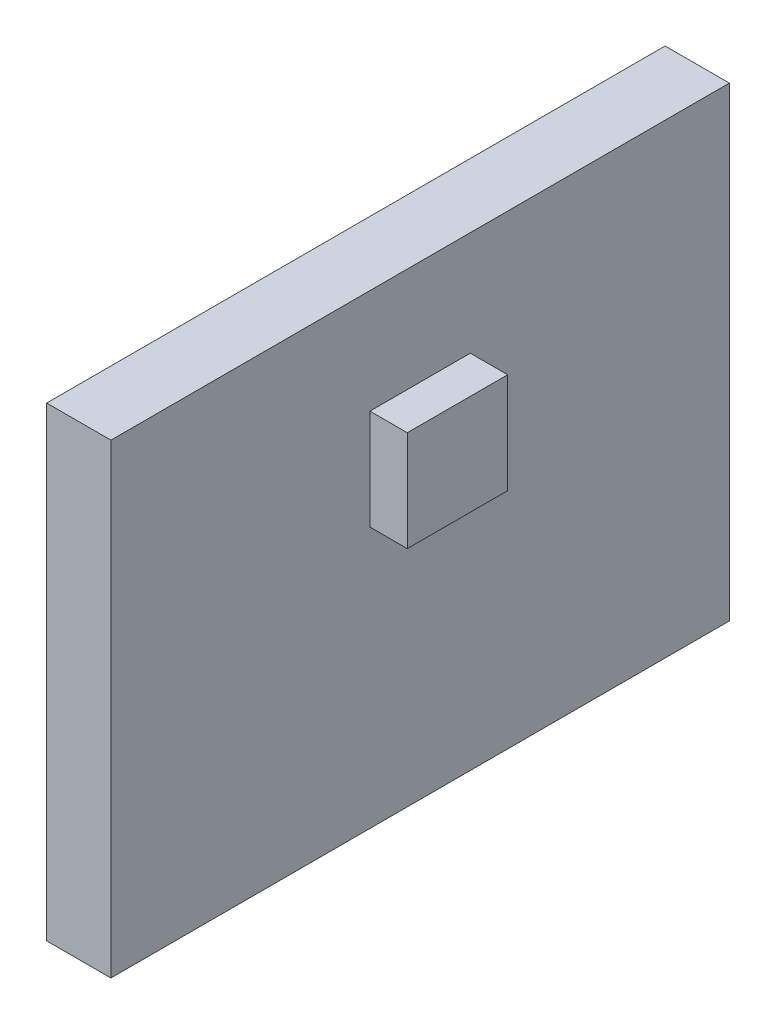
ISO-10303-21;
HEADER;
FILE_DESCRIPTION(('STEP AP214'),'2;1');
FILE_NAME('part.step','',(''),(''),'','','');
FILE_SCHEMA(('AUTOMOTIVE_DESIGN { 1 0 10303 214 1 1 1 1 }'));
ENDSEC;
DATA;
#1=APPLICATION_CONTEXT('core data for automotive mechanical design processes');
#2=APPLICATION_PROTOCOL_DEFINITION('international standard','automotive_design',2000,#1);
#3=PRODUCT_CONTEXT('',#1,'mechanical');
#4=PRODUCT('Part','Part','',(#3));
#5=PRODUCT_RELATED_PRODUCT_CATEGORY('part','',(#4));
#6=PRODUCT_DEFINITION_FORMATION('','',#4);
#7=PRODUCT_DEFINITION_CONTEXT('part definition',#1,'design');
#8=PRODUCT_DEFINITION('design','',#6,#7);
#9=PRODUCT_DEFINITION_SHAPE('','',#8);
#10=(LENGTH_UNIT() NAMED_UNIT(*) SI_UNIT(.MILLI.,.METRE.));
#11=(NAMED_UNIT(*) PLANE_ANGLE_UNIT() SI_UNIT($,.RADIAN.));
#12=(NAMED_UNIT(*) SI_UNIT($,.STERADIAN.) SOLID_ANGLE_UNIT());
#13=UNCERTAINTY_MEASURE_WITH_UNIT(LENGTH_MEASURE(1.E-05),#10,'distance_accuracy_value','');
#14=(GEOMETRIC_REPRESENTATION_CONTEXT(3) GLOBAL_UNCERTAINTY_ASSIGNED_CONTEXT((#13)) GLOBAL_UNIT_ASSIGNED_CONTEXT((#10,
#11,#12)) REPRESENTATION_CONTEXT('',''));
#15=CARTESIAN_POINT('',(0.,0.,0.));
#16=DIRECTION('',(0.,0.,1.));
#17=DIRECTION('',(1.,0.,0.));
#18=AXIS2_PLACEMENT_3D('',#15,#16,#17);
#19=CARTESIAN_POINT('',(-43.2,-132.5,33.7));
#20=DIRECTION('',(-1.,0.,0.));
#21=DIRECTION('',(0.,0.,1.));
#22=AXIS2_PLACEMENT_3D('',#19,#20,#21);
#23=PLANE('',#22);
#24=DIRECTION('',(0.,0.,-1.));
#25=VECTOR('',#24,1.);
#26=CARTESIAN_POINT('',(-43.2,-123.5,27.25));
#27=LINE('',#26,#25);
#28=CARTESIAN_POINT('',(-43.2,-123.5,27.25));
#29=VERTEX_POINT('',#28);
#30=CARTESIAN_POINT('',(-43.2,-123.5,24.75));
#31=VERTEX_POINT('',#30);
#32=EDGE_CURVE('E120',#29,#31,#27,.T.);
#33=ORIENTED_EDGE('',*,*,#32,.T.);
#34=DIRECTION('',(0.,-1.,0.));
#35=VECTOR('',#34,1.);
#36=CARTESIAN_POINT('',(-43.2,-126.,24.75));
#37=LINE('',#36,#35);
#38=CARTESIAN_POINT('',(-43.2,-126.,24.75));
#39=VERTEX_POINT('',#38);
#40=EDGE_CURVE('E53',#31,#39,#37,.T.);
#41=ORIENTED_EDGE('',*,*,#40,.T.);
#42=DIRECTION('',(0.,0.,-1.));
#43=VECTOR('',#42,1.);
#44=CARTESIAN_POINT('',(-43.2,-126.,27.25));
#45=LINE('',#44,#43);
#46=CARTESIAN_POINT('',(-43.2,-126.,27.25));
#47=VERTEX_POINT('',#46);
#48=EDGE_CURVE('E143',#47,#39,#45,.T.);
#49=ORIENTED_EDGE('',*,*,#48,.F.);
#50=DIRECTION('',(0.,-1.,0.));
#51=VECTOR('',#50,1.);
#52=CARTESIAN_POINT('',(-43.2,-126.,27.25));
#53=LINE('',#52,#51);
#54=EDGE_CURVE('E123',#29,#47,#53,.T.);
#55=ORIENTED_EDGE('',*,*,#54,.F.);
#56=EDGE_LOOP('',(#33,#41,#49,#55));
#57=FACE_BOUND('',#56,.T.);
#58=DIRECTION('',(0.,1.,0.));
#59=VECTOR('',#58,1.);
#60=CARTESIAN_POINT('',(-43.2,-132.5,18.3));
#61=LINE('',#60,#59);
#62=CARTESIAN_POINT('',(-43.2,-132.5,18.3));
#63=VERTEX_POINT('',#62);
#64=CARTESIAN_POINT('',(-43.2,-120.9,18.3));
#65=VERTEX_POINT('',#64);
#66=EDGE_CURVE('E138',#63,#65,#61,.T.);
#67=ORIENTED_EDGE('',*,*,#66,.T.);
#68=DIRECTION('',(0.,0.,-1.));
#69=VECTOR('',#68,1.);
#70=CARTESIAN_POINT('',(-43.2,-120.9,33.7));
#71=LINE('',#70,#69);
#72=CARTESIAN_POINT('',(-43.2,-120.9,33.7));
#73=VERTEX_POINT('',#72);
#74=EDGE_CURVE('E11',#73,#65,#71,.T.);
#75=ORIENTED_EDGE('',*,*,#74,.F.);
#76=DIRECTION('',(0.,1.,0.));
#77=VECTOR('',#76,1.);
#78=CARTESIAN_POINT('',(-43.2,-132.5,33.7));
#79=LINE('',#78,#77);
#80=CARTESIAN_POINT('',(-43.2,-132.5,33.7));
#81=VERTEX_POINT('',#80);
#82=EDGE_CURVE('E147',#81,#73,#79,.T.);
#83=ORIENTED_EDGE('',*,*,#82,.F.);
#84=DIRECTION('',(0.,0.,-1.));
#85=VECTOR('',#84,1.);
#86=CARTESIAN_POINT('',(-43.2,-132.5,33.7));
#87=LINE('',#86,#85);
#88=EDGE_CURVE('E152',#81,#63,#87,.T.);
#89=ORIENTED_EDGE('',*,*,#88,.T.);
#90=EDGE_LOOP('',(#67,#75,#83,#89));
#91=FACE_BOUND('',#90,.T.);
#92=ADVANCED_FACE('F39',(#57,#91),#23,.F.);
#93=CARTESIAN_POINT('',(-44.8,-120.9,33.7));
#94=DIRECTION('',(0.,-1.,0.));
#95=DIRECTION('',(0.,0.,-1.));
#96=AXIS2_PLACEMENT_3D('',#93,#94,#95);
#97=PLANE('',#96);
#98=DIRECTION('',(-1.,0.,0.));
#99=VECTOR('',#98,1.);
#100=CARTESIAN_POINT('',(-44.8,-120.9,18.3));
#101=LINE('',#100,#99);
#102=CARTESIAN_POINT('',(-44.8,-120.9,18.3));
#103=VERTEX_POINT('',#102);
#104=EDGE_CURVE('E141',#65,#103,#101,.T.);
#105=ORIENTED_EDGE('',*,*,#104,.T.);
#106=DIRECTION('',(0.,0.,-1.));
#107=VECTOR('',#106,1.);
#108=CARTESIAN_POINT('',(-44.8,-120.9,33.7));
#109=LINE('',#108,#107);
#110=CARTESIAN_POINT('',(-44.8,-120.9,33.7));
#111=VERTEX_POINT('',#110);
#112=EDGE_CURVE('E46',#111,#103,#109,.T.);
#113=ORIENTED_EDGE('',*,*,#112,.F.);
#114=DIRECTION('',(-1.,0.,0.));
#115=VECTOR('',#114,1.);
#116=CARTESIAN_POINT('',(-44.8,-120.9,33.7));
#117=LINE('',#116,#115);
#118=EDGE_CURVE('E90',#73,#111,#117,.T.);
#119=ORIENTED_EDGE('',*,*,#118,.F.);
#120=ORIENTED_EDGE('',*,*,#74,.T.);
#121=EDGE_LOOP('',(#105,#113,#119,#120));
#122=FACE_BOUND('',#121,.T.);
#123=ADVANCED_FACE('F181',(#122),#97,.F.);
#124=CARTESIAN_POINT('',(-44.8,-132.5,33.7));
#125=DIRECTION('',(1.,0.,0.));
#126=DIRECTION('',(0.,0.,-1.));
#127=AXIS2_PLACEMENT_3D('',#124,#125,#126);
#128=PLANE('',#127);
#129=DIRECTION('',(0.,-1.,0.));
#130=VECTOR('',#129,1.);
#131=CARTESIAN_POINT('',(-44.8,-132.5,18.3));
#132=LINE('',#131,#130);
#133=CARTESIAN_POINT('',(-44.8,-132.5,18.3));
#134=VERTEX_POINT('',#133);
#135=EDGE_CURVE('E155',#103,#134,#132,.T.);
#136=ORIENTED_EDGE('',*,*,#135,.T.);
#137=DIRECTION('',(0.,0.,-1.));
#138=VECTOR('',#137,1.);
#139=CARTESIAN_POINT('',(-44.8,-132.5,33.7));
#140=LINE('',#139,#138);
#141=CARTESIAN_POINT('',(-44.8,-132.5,33.7));
#142=VERTEX_POINT('',#141);
#143=EDGE_CURVE('E159',#142,#134,#140,.T.);
#144=ORIENTED_EDGE('',*,*,#143,.F.);
#145=DIRECTION('',(0.,-1.,0.));
#146=VECTOR('',#145,1.);
#147=CARTESIAN_POINT('',(-44.8,-132.5,33.7));
#148=LINE('',#147,#146);
#149=EDGE_CURVE('E150',#111,#142,#148,.T.);
#150=ORIENTED_EDGE('',*,*,#149,.F.);
#151=ORIENTED_EDGE('',*,*,#112,.T.);
#152=EDGE_LOOP('',(#136,#144,#150,#151));
#153=FACE_BOUND('',#152,.T.);
#154=ADVANCED_FACE('F164',(#153),#128,.F.);
#155=CARTESIAN_POINT('',(-44.8,-132.5,33.7));
#156=DIRECTION('',(0.,1.,0.));
#157=DIRECTION('',(0.,0.,1.));
#158=AXIS2_PLACEMENT_3D('',#155,#156,#157);
#159=PLANE('',#158);
#160=DIRECTION('',(1.,0.,0.));
#161=VECTOR('',#160,1.);
#162=CARTESIAN_POINT('',(-44.8,-132.5,18.3));
#163=LINE('',#162,#161);
#164=EDGE_CURVE('E83',#134,#63,#163,.T.);
#165=ORIENTED_EDGE('',*,*,#164,.T.);
#166=ORIENTED_EDGE('',*,*,#88,.F.);
#167=DIRECTION('',(1.,0.,0.));
#168=VECTOR('',#167,1.);
#169=CARTESIAN_POINT('',(-44.8,-132.5,33.7));
#170=LINE('',#169,#168);
#171=EDGE_CURVE('E62',#142,#81,#170,.T.);
#172=ORIENTED_EDGE('',*,*,#171,.F.);
#173=ORIENTED_EDGE('',*,*,#143,.T.);
#174=EDGE_LOOP('',(#165,#166,#172,#173));
#175=FACE_BOUND('',#174,.T.);
#176=ADVANCED_FACE('F172',(#175),#159,.F.);
#177=CARTESIAN_POINT('',(0.,0.,33.7));
#178=DIRECTION('',(0.,0.,-1.));
#179=DIRECTION('',(-1.,0.,0.));
#180=AXIS2_PLACEMENT_3D('',#177,#178,#179);
#181=PLANE('',#180);
#182=ORIENTED_EDGE('',*,*,#82,.T.);
#183=ORIENTED_EDGE('',*,*,#118,.T.);
#184=ORIENTED_EDGE('',*,*,#149,.T.);
#185=ORIENTED_EDGE('',*,*,#171,.T.);
#186=EDGE_LOOP('',(#182,#183,#184,#185));
#187=FACE_BOUND('',#186,.T.);
#188=ADVANCED_FACE('F174',(#187),#181,.F.);
#189=CARTESIAN_POINT('',(0.,0.,18.3));
#190=DIRECTION('',(0.,0.,-1.));
#191=DIRECTION('',(-1.,0.,0.));
#192=AXIS2_PLACEMENT_3D('',#189,#190,#191);
#193=PLANE('',#192);
#194=ORIENTED_EDGE('',*,*,#66,.F.);
#195=ORIENTED_EDGE('',*,*,#164,.F.);
#196=ORIENTED_EDGE('',*,*,#135,.F.);
#197=ORIENTED_EDGE('',*,*,#104,.F.);
#198=EDGE_LOOP('',(#194,#195,#196,#197));
#199=FACE_BOUND('',#198,.T.);
#200=ADVANCED_FACE('F168',(#199),#193,.T.);
#201=CARTESIAN_POINT('',(-42.27,-126.,27.25));
#202=DIRECTION('',(-1.,0.,0.));
#203=DIRECTION('',(0.,0.,1.));
#204=AXIS2_PLACEMENT_3D('',#201,#202,#203);
#205=PLANE('',#204);
#206=DIRECTION('',(0.,1.,0.));
#207=VECTOR('',#206,1.);
#208=CARTESIAN_POINT('',(-42.27,-126.,24.75));
#209=LINE('',#208,#207);
#210=CARTESIAN_POINT('',(-42.27,-126.,24.75));
#211=VERTEX_POINT('',#210);
#212=CARTESIAN_POINT('',(-42.27,-123.5,24.75));
#213=VERTEX_POINT('',#212);
#214=EDGE_CURVE('E137',#211,#213,#209,.T.);
#215=ORIENTED_EDGE('',*,*,#214,.T.);
#216=DIRECTION('',(0.,0.,-1.));
#217=VECTOR('',#216,1.);
#218=CARTESIAN_POINT('',(-42.27,-123.5,27.25));
#219=LINE('',#218,#217);
#220=CARTESIAN_POINT('',(-42.27,-123.5,27.25));
#221=VERTEX_POINT('',#220);
#222=EDGE_CURVE('E117',#221,#213,#219,.T.);
#223=ORIENTED_EDGE('',*,*,#222,.F.);
#224=DIRECTION('',(0.,1.,0.));
#225=VECTOR('',#224,1.);
#226=CARTESIAN_POINT('',(-42.27,-126.,27.25));
#227=LINE('',#226,#225);
#228=CARTESIAN_POINT('',(-42.27,-126.,27.25));
#229=VERTEX_POINT('',#228);
#230=EDGE_CURVE('E124',#229,#221,#227,.T.);
#231=ORIENTED_EDGE('',*,*,#230,.F.);
#232=DIRECTION('',(0.,0.,-1.));
#233=VECTOR('',#232,1.);
#234=CARTESIAN_POINT('',(-42.27,-126.,27.25));
#235=LINE('',#234,#233);
#236=EDGE_CURVE('E191',#229,#211,#235,.T.);
#237=ORIENTED_EDGE('',*,*,#236,.T.);
#238=EDGE_LOOP('',(#215,#223,#231,#237));
#239=FACE_BOUND('',#238,.T.);
#240=ADVANCED_FACE('F135',(#239),#205,.F.);
#241=CARTESIAN_POINT('',(-43.2,-123.5,27.25));
#242=DIRECTION('',(0.,-1.,0.));
#243=DIRECTION('',(0.,0.,-1.));
#244=AXIS2_PLACEMENT_3D('',#241,#242,#243);
#245=PLANE('',#244);
#246=DIRECTION('',(-1.,0.,0.));
#247=VECTOR('',#246,1.);
#248=CARTESIAN_POINT('',(-43.2,-123.5,24.75));
#249=LINE('',#248,#247);
#250=EDGE_CURVE('E195',#213,#31,#249,.T.);
#251=ORIENTED_EDGE('',*,*,#250,.T.);
#252=ORIENTED_EDGE('',*,*,#32,.F.);
#253=DIRECTION('',(-1.,0.,0.));
#254=VECTOR('',#253,1.);
#255=CARTESIAN_POINT('',(-43.2,-123.5,27.25));
#256=LINE('',#255,#254);
#257=EDGE_CURVE('E113',#221,#29,#256,.T.);
#258=ORIENTED_EDGE('',*,*,#257,.F.);
#259=ORIENTED_EDGE('',*,*,#222,.T.);
#260=EDGE_LOOP('',(#251,#252,#258,#259));
#261=FACE_BOUND('',#260,.T.);
#262=ADVANCED_FACE('F115',(#261),#245,.F.);
#263=CARTESIAN_POINT('',(-43.2,-126.,27.25));
#264=DIRECTION('',(0.,1.,0.));
#265=DIRECTION('',(0.,0.,1.));
#266=AXIS2_PLACEMENT_3D('',#263,#264,#265);
#267=PLANE('',#266);
#268=DIRECTION('',(1.,0.,0.));
#269=VECTOR('',#268,1.);
#270=CARTESIAN_POINT('',(-43.2,-126.,24.75));
#271=LINE('',#270,#269);
#272=EDGE_CURVE('E133',#39,#211,#271,.T.);
#273=ORIENTED_EDGE('',*,*,#272,.T.);
#274=ORIENTED_EDGE('',*,*,#236,.F.);
#275=DIRECTION('',(1.,0.,0.));
#276=VECTOR('',#275,1.);
#277=CARTESIAN_POINT('',(-43.2,-126.,27.25));
#278=LINE('',#277,#276);
#279=EDGE_CURVE('E129',#47,#229,#278,.T.);
#280=ORIENTED_EDGE('',*,*,#279,.F.);
#281=ORIENTED_EDGE('',*,*,#48,.T.);
#282=EDGE_LOOP('',(#273,#274,#280,#281));
#283=FACE_BOUND('',#282,.T.);
#284=ADVANCED_FACE('F200',(#283),#267,.F.);
#285=CARTESIAN_POINT('',(0.,0.,27.25));
#286=DIRECTION('',(0.,0.,-1.));
#287=DIRECTION('',(-1.,0.,0.));
#288=AXIS2_PLACEMENT_3D('',#285,#286,#287);
#289=PLANE('',#288);
#290=ORIENTED_EDGE('',*,*,#230,.T.);
#291=ORIENTED_EDGE('',*,*,#257,.T.);
#292=ORIENTED_EDGE('',*,*,#54,.T.);
#293=ORIENTED_EDGE('',*,*,#279,.T.);
#294=EDGE_LOOP('',(#290,#291,#292,#293));
#295=FACE_BOUND('',#294,.T.);
#296=ADVANCED_FACE('F127',(#295),#289,.F.);
#297=CARTESIAN_POINT('',(0.,0.,24.75));
#298=DIRECTION('',(0.,0.,-1.));
#299=DIRECTION('',(-1.,0.,0.));
#300=AXIS2_PLACEMENT_3D('',#297,#298,#299);
#301=PLANE('',#300);
#302=ORIENTED_EDGE('',*,*,#214,.F.);
#303=ORIENTED_EDGE('',*,*,#272,.F.);
#304=ORIENTED_EDGE('',*,*,#40,.F.);
#305=ORIENTED_EDGE('',*,*,#250,.F.);
#306=EDGE_LOOP('',(#302,#303,#304,#305));
#307=FACE_BOUND('',#306,.T.);
#308=ADVANCED_FACE('F201',(#307),#301,.T.);
#309=CLOSED_SHELL('',(#92,#123,#154,#176,#188,#200,#240,#262,#284,#296,#308));
#310=MANIFOLD_SOLID_BREP('B2',#309);
#311=ADVANCED_BREP_SHAPE_REPRESENTATION('',(#18,#310),#14);
#312=SHAPE_DEFINITION_REPRESENTATION(#9,#311);
ENDSEC;
END-ISO-10303-21;
